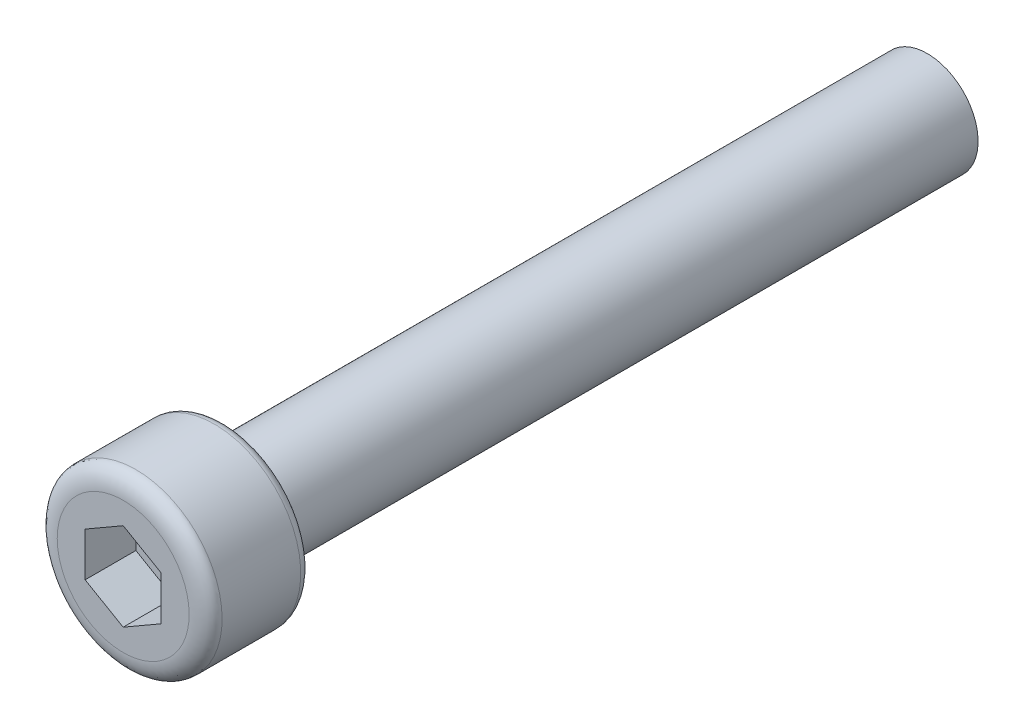
ISO-10303-21;
HEADER;
FILE_DESCRIPTION(('STEP AP214'),'2;1');
FILE_NAME('part.step','',(''),(''),'','','');
FILE_SCHEMA(('AUTOMOTIVE_DESIGN { 1 0 10303 214 1 1 1 1 }'));
ENDSEC;
DATA;
#1=APPLICATION_CONTEXT('core data for automotive mechanical design processes');
#2=APPLICATION_PROTOCOL_DEFINITION('international standard','automotive_design',2000,#1);
#3=PRODUCT_CONTEXT('',#1,'mechanical');
#4=PRODUCT('Part','Part','',(#3));
#5=PRODUCT_RELATED_PRODUCT_CATEGORY('part','',(#4));
#6=PRODUCT_DEFINITION_FORMATION('','',#4);
#7=PRODUCT_DEFINITION_CONTEXT('part definition',#1,'design');
#8=PRODUCT_DEFINITION('design','',#6,#7);
#9=PRODUCT_DEFINITION_SHAPE('','',#8);
#10=(LENGTH_UNIT() NAMED_UNIT(*) SI_UNIT(.MILLI.,.METRE.));
#11=(NAMED_UNIT(*) PLANE_ANGLE_UNIT() SI_UNIT($,.RADIAN.));
#12=(NAMED_UNIT(*) SI_UNIT($,.STERADIAN.) SOLID_ANGLE_UNIT());
#13=UNCERTAINTY_MEASURE_WITH_UNIT(LENGTH_MEASURE(1.E-05),#10,'distance_accuracy_value','');
#14=(GEOMETRIC_REPRESENTATION_CONTEXT(3) GLOBAL_UNCERTAINTY_ASSIGNED_CONTEXT((#13)) GLOBAL_UNIT_ASSIGNED_CONTEXT((#10,
#11,#12)) REPRESENTATION_CONTEXT('',''));
#15=CARTESIAN_POINT('',(0.,0.,0.));
#16=DIRECTION('',(0.,0.,1.));
#17=DIRECTION('',(1.,0.,0.));
#18=AXIS2_PLACEMENT_3D('',#15,#16,#17);
#19=CARTESIAN_POINT('',(0.,0.,16.));
#20=DIRECTION('',(0.,0.,1.));
#21=DIRECTION('',(1.,0.,0.));
#22=AXIS2_PLACEMENT_3D('',#19,#20,#21);
#23=PLANE('',#22);
#24=DIRECTION('',(-0.866025403784439,0.5,0.));
#25=VECTOR('',#24,1.);
#26=CARTESIAN_POINT('',(1.5,0.86602540378444,16.));
#27=LINE('',#26,#25);
#28=CARTESIAN_POINT('',(1.5,0.86602540378444,16.));
#29=VERTEX_POINT('',#28);
#30=CARTESIAN_POINT('',(0.,1.73205080756888,16.));
#31=VERTEX_POINT('',#30);
#32=EDGE_CURVE('E61',#29,#31,#27,.T.);
#33=ORIENTED_EDGE('',*,*,#32,.F.);
#34=DIRECTION('',(0.,1.,0.));
#35=VECTOR('',#34,1.);
#36=CARTESIAN_POINT('',(1.5,-0.866025403784439,16.));
#37=LINE('',#36,#35);
#38=CARTESIAN_POINT('',(1.5,-0.866025403784439,16.));
#39=VERTEX_POINT('',#38);
#40=EDGE_CURVE('E144',#39,#29,#37,.T.);
#41=ORIENTED_EDGE('',*,*,#40,.F.);
#42=DIRECTION('',(0.866025403784439,0.5,0.));
#43=VECTOR('',#42,1.);
#44=CARTESIAN_POINT('',(0.,-1.73205080756888,16.));
#45=LINE('',#44,#43);
#46=CARTESIAN_POINT('',(0.,-1.73205080756888,16.));
#47=VERTEX_POINT('',#46);
#48=EDGE_CURVE('E142',#47,#39,#45,.T.);
#49=ORIENTED_EDGE('',*,*,#48,.F.);
#50=DIRECTION('',(0.866025403784438,-0.5,0.));
#51=VECTOR('',#50,1.);
#52=CARTESIAN_POINT('',(-1.5,-0.866025403784438,16.));
#53=LINE('',#52,#51);
#54=CARTESIAN_POINT('',(-1.5,-0.866025403784438,16.));
#55=VERTEX_POINT('',#54);
#56=EDGE_CURVE('E109',#55,#47,#53,.T.);
#57=ORIENTED_EDGE('',*,*,#56,.F.);
#58=DIRECTION('',(0.,-1.,0.));
#59=VECTOR('',#58,1.);
#60=CARTESIAN_POINT('',(-1.5,0.866025403784439,16.));
#61=LINE('',#60,#59);
#62=CARTESIAN_POINT('',(-1.5,0.866025403784439,16.));
#63=VERTEX_POINT('',#62);
#64=EDGE_CURVE('E138',#63,#55,#61,.T.);
#65=ORIENTED_EDGE('',*,*,#64,.F.);
#66=DIRECTION('',(-0.866025403784439,-0.5,0.));
#67=VECTOR('',#66,1.);
#68=CARTESIAN_POINT('',(0.,1.73205080756888,16.));
#69=LINE('',#68,#67);
#70=EDGE_CURVE('E135',#31,#63,#69,.T.);
#71=ORIENTED_EDGE('',*,*,#70,.F.);
#72=EDGE_LOOP('',(#33,#41,#49,#57,#65,#71));
#73=FACE_BOUND('',#72,.T.);
#74=CARTESIAN_POINT('',(-2.6,0.,16.));
#75=CARTESIAN_POINT('',(-2.6,0.340339195747885,16.));
#76=CARTESIAN_POINT('',(-2.53232895612653,0.68054450708638,16.));
#77=CARTESIAN_POINT('',(-2.27184461293216,1.30940934121209,16.));
#78=CARTESIAN_POINT('',(-2.07913378430198,1.5978214778681,16.));
#79=CARTESIAN_POINT('',(-1.59782147786807,2.07913378430194,16.));
#80=CARTESIAN_POINT('',(-1.30940934121209,2.27184461293216,16.));
#81=CARTESIAN_POINT('',(-0.680544507086378,2.53232895612653,16.));
#82=CARTESIAN_POINT('',(-0.340339195747888,2.6,16.));
#83=CARTESIAN_POINT('',(0.340339195747889,2.6,16.));
#84=CARTESIAN_POINT('',(0.680544507086413,2.53232895612653,16.));
#85=CARTESIAN_POINT('',(1.30940934121205,2.27184461293216,16.));
#86=CARTESIAN_POINT('',(1.59782147786806,2.07913378430191,16.));
#87=CARTESIAN_POINT('',(2.07913378430199,1.59782147786813,16.));
#88=CARTESIAN_POINT('',(2.27184461293214,1.30940934121206,16.));
#89=CARTESIAN_POINT('',(2.53232895612655,0.680544507086402,16.));
#90=CARTESIAN_POINT('',(2.6,0.340339195748111,16.));
#91=CARTESIAN_POINT('',(2.6,-0.340339195748118,16.));
#92=CARTESIAN_POINT('',(2.53232895612663,-0.680544507086151,16.));
#93=CARTESIAN_POINT('',(2.27184461293207,-1.30940934121232,16.));
#94=CARTESIAN_POINT('',(2.07913378430184,-1.59782147786829,16.));
#95=CARTESIAN_POINT('',(1.59782147786821,-2.07913378430177,16.));
#96=CARTESIAN_POINT('',(1.30940934121224,-2.27184461293209,16.));
#97=CARTESIAN_POINT('',(0.68054450708623,-2.53232895612661,16.));
#98=CARTESIAN_POINT('',(0.340339195748087,-2.60000000000001,16.));
#99=CARTESIAN_POINT('',(-0.340339195748083,-2.60000000000001,16.));
#100=CARTESIAN_POINT('',(-0.680544507086233,-2.53232895612661,16.));
#101=CARTESIAN_POINT('',(-1.30940934121224,-2.27184461293209,16.));
#102=CARTESIAN_POINT('',(-1.59782147786814,-2.07913378430198,16.));
#103=CARTESIAN_POINT('',(-2.0791337843019,-1.59782147786808,16.));
#104=CARTESIAN_POINT('',(-2.27184461293223,-1.30940934121205,16.));
#105=CARTESIAN_POINT('',(-2.53232895612646,-0.680544507086417,16.));
#106=CARTESIAN_POINT('',(-2.6,-0.340339195747892,16.));
#107=CARTESIAN_POINT('',(-2.6,0.,16.));
#108=(BOUNDED_CURVE() B_SPLINE_CURVE(3,(#74,#75,#76,#77,#78,#79,#80,#81,#82,#83,#84,#85,#86,#87,
#88,#89,#90,#91,#92,#93,#94,#95,#96,#97,#98,#99,#100,#101,#102,#103,#104,#105,#106,#107),
.UNSPECIFIED.,.T.,.F.) B_SPLINE_CURVE_WITH_KNOTS((4,2,2,2,2,2,2,2,2,2,2,2,2,2,2,2,4),
(-3.14159265358979,-2.74889357189107,-2.35619449019234,-1.96349540849362,-1.5707963267949,
-1.17809724509617,-0.785398163397448,-0.392699081698724,0.,0.392699081698724,0.785398163397448,
1.17809724509617,1.5707963267949,1.96349540849362,2.35619449019234,2.74889357189107,
3.14159265358979),
.UNSPECIFIED.) CURVE() GEOMETRIC_REPRESENTATION_ITEM() RATIONAL_B_SPLINE_CURVE((1.,1.,1.,1.,1.,
1.,1.,1.,1.,1.,1.,1.,1.,1.,1.,1.,1.,1.,1.,1.,1.,1.,1.,1.,1.,1.,1.,1.,1.,1.,1.,1.,1.,1.)) REPRESENTATION_ITEM(''));
#109=CARTESIAN_POINT('',(-2.6,0.,16.));
#110=VERTEX_POINT('',#109);
#111=EDGE_CURVE('E12',#110,#110,#108,.F.);
#112=ORIENTED_EDGE('',*,*,#111,.T.);
#113=EDGE_LOOP('',(#112));
#114=FACE_BOUND('',#113,.T.);
#115=ADVANCED_FACE('F40',(#73,#114),#23,.T.);
#116=CARTESIAN_POINT('',(0.,0.,-16.));
#117=DIRECTION('',(0.,0.,-1.));
#118=DIRECTION('',(-1.,0.,0.));
#119=AXIS2_PLACEMENT_3D('',#116,#117,#118);
#120=CYLINDRICAL_SURFACE('',#119,3.4);
#121=CARTESIAN_POINT('',(-3.4,0.,15.5));
#122=CARTESIAN_POINT('',(-3.4,-0.445058948285704,15.5));
#123=CARTESIAN_POINT('',(-3.31150709647314,-0.889942816959172,15.5));
#124=CARTESIAN_POINT('',(-2.97087372460362,-1.71230452312344,15.5));
#125=CARTESIAN_POINT('',(-2.71886725639478,-2.08945885567375,15.5));
#126=CARTESIAN_POINT('',(-2.08945885567374,-2.71886725639479,15.5));
#127=CARTESIAN_POINT('',(-1.71230452312376,-2.97087372460349,15.5));
#128=CARTESIAN_POINT('',(-0.889942816958865,-3.31150709647327,15.5));
#129=CARTESIAN_POINT('',(-0.445058948285955,-3.40000000000001,15.5));
#130=CARTESIAN_POINT('',(0.44505894828596,-3.40000000000001,15.5));
#131=CARTESIAN_POINT('',(0.889942816958893,-3.31150709647326,15.5));
#132=CARTESIAN_POINT('',(1.71230452312372,-2.97087372460351,15.5));
#133=CARTESIAN_POINT('',(2.08945885567385,-2.71886725639468,15.5));
#134=CARTESIAN_POINT('',(2.71886725639468,-2.08945885567385,15.5));
#135=CARTESIAN_POINT('',(2.97087372460348,-1.71230452312378,15.5));
#136=CARTESIAN_POINT('',(3.31150709647328,-0.889942816958835,15.5));
#137=CARTESIAN_POINT('',(3.4,-0.445058948285999,15.5));
#138=CARTESIAN_POINT('',(3.4,0.445058948285992,15.5));
#139=CARTESIAN_POINT('',(3.31150709647316,0.889942816959107,15.5));
#140=CARTESIAN_POINT('',(2.97087372460359,1.7123045231235,15.5));
#141=CARTESIAN_POINT('',(2.71886725639486,2.08945885567366,15.5));
#142=CARTESIAN_POINT('',(2.08945885567366,2.71886725639486,15.5));
#143=CARTESIAN_POINT('',(1.7123045231235,2.97087372460359,15.5));
#144=CARTESIAN_POINT('',(0.889942816959111,3.31150709647316,15.5));
#145=CARTESIAN_POINT('',(0.445058948285701,3.4,15.5));
#146=CARTESIAN_POINT('',(-0.4450589482857,3.4,15.5));
#147=CARTESIAN_POINT('',(-0.889942816959134,3.31150709647315,15.5));
#148=CARTESIAN_POINT('',(-1.71230452312348,2.9708737246036,15.5));
#149=CARTESIAN_POINT('',(-2.08945885567363,2.71886725639489,15.5));
#150=CARTESIAN_POINT('',(-2.7188672563949,2.08945885567362,15.5));
#151=CARTESIAN_POINT('',(-2.97087372460359,1.7123045231235,15.5));
#152=CARTESIAN_POINT('',(-3.31150709647316,0.889942816959117,15.5));
#153=CARTESIAN_POINT('',(-3.4,0.445058948285697,15.5));
#154=CARTESIAN_POINT('',(-3.4,0.,15.5));
#155=(BOUNDED_CURVE() B_SPLINE_CURVE(3,(#121,#122,#123,#124,#125,#126,#127,#128,#129,#130,#131,
#132,#133,#134,#135,#136,#137,#138,#139,#140,#141,#142,#143,#144,#145,#146,#147,#148,#149,#150,
#151,#152,#153,#154),.UNSPECIFIED.,.T.,.F.) B_SPLINE_CURVE_WITH_KNOTS((4,2,2,2,2,2,2,2,2,2,2,2,
2,2,2,2,4),(-3.14159265358979,-2.74889357189107,-2.35619449019234,-1.96349540849362,
-1.5707963267949,-1.17809724509617,-0.785398163397448,-0.392699081698724,0.,0.392699081698724,
0.785398163397448,1.17809724509617,1.5707963267949,1.96349540849362,2.35619449019234,
2.74889357189107,3.14159265358979),
.UNSPECIFIED.) CURVE() GEOMETRIC_REPRESENTATION_ITEM() RATIONAL_B_SPLINE_CURVE((1.,1.,1.,1.,1.,
1.,1.,1.,1.,1.,1.,1.,1.,1.,1.,1.,1.,1.,1.,1.,1.,1.,1.,1.,1.,1.,1.,1.,1.,1.,1.,1.,1.,1.)) REPRESENTATION_ITEM(''));
#156=CARTESIAN_POINT('',(-3.4,0.,15.5));
#157=VERTEX_POINT('',#156);
#158=EDGE_CURVE('E54',#157,#157,#155,.F.);
#159=ORIENTED_EDGE('',*,*,#158,.T.);
#160=EDGE_LOOP('',(#159));
#161=FACE_BOUND('',#160,.T.);
#162=CARTESIAN_POINT('',(0.,0.,12.4));
#163=DIRECTION('',(0.,0.,-1.));
#164=DIRECTION('',(-1.,0.,0.));
#165=AXIS2_PLACEMENT_3D('',#162,#163,#164);
#166=CIRCLE('',#165,3.4);
#167=CARTESIAN_POINT('',(-3.4,0.,12.4));
#168=VERTEX_POINT('',#167);
#169=EDGE_CURVE('E165',#168,#168,#166,.F.);
#170=ORIENTED_EDGE('',*,*,#169,.T.);
#171=EDGE_LOOP('',(#170));
#172=FACE_BOUND('',#171,.T.);
#173=ADVANCED_FACE('F177',(#161,#172),#120,.T.);
#174=CARTESIAN_POINT('',(0.,3.4,12.));
#175=DIRECTION('',(0.,0.,-1.));
#176=DIRECTION('',(-1.,0.,0.));
#177=AXIS2_PLACEMENT_3D('',#174,#175,#176);
#178=PLANE('',#177);
#179=CARTESIAN_POINT('',(0.,0.,12.));
#180=DIRECTION('',(0.,0.,-1.));
#181=DIRECTION('',(-1.,0.,0.));
#182=AXIS2_PLACEMENT_3D('',#179,#180,#181);
#183=CIRCLE('',#182,3.);
#184=CARTESIAN_POINT('',(-3.,0.,12.));
#185=VERTEX_POINT('',#184);
#186=EDGE_CURVE('E162',#185,#185,#183,.T.);
#187=ORIENTED_EDGE('',*,*,#186,.T.);
#188=EDGE_LOOP('',(#187));
#189=FACE_BOUND('',#188,.T.);
#190=CARTESIAN_POINT('',(0.,0.,12.));
#191=DIRECTION('',(0.,0.,-1.));
#192=DIRECTION('',(-1.,0.,0.));
#193=AXIS2_PLACEMENT_3D('',#190,#191,#192);
#194=CIRCLE('',#193,2.00000000000001);
#195=CARTESIAN_POINT('',(-2.00000000000001,0.,12.));
#196=VERTEX_POINT('',#195);
#197=EDGE_CURVE('E148',#196,#196,#194,.T.);
#198=ORIENTED_EDGE('',*,*,#197,.F.);
#199=EDGE_LOOP('',(#198));
#200=FACE_BOUND('',#199,.T.);
#201=ADVANCED_FACE('F187',(#189,#200),#178,.T.);
#202=CARTESIAN_POINT('',(0.,0.,-16.));
#203=DIRECTION('',(0.,0.,-1.));
#204=DIRECTION('',(-1.,0.,0.));
#205=AXIS2_PLACEMENT_3D('',#202,#203,#204);
#206=CYLINDRICAL_SURFACE('',#205,2.00000000000001);
#207=CARTESIAN_POINT('',(0.,0.,-15.7));
#208=DIRECTION('',(0.,0.,-1.));
#209=DIRECTION('',(-1.,0.,0.));
#210=AXIS2_PLACEMENT_3D('',#207,#208,#209);
#211=CIRCLE('',#210,2.00000000000001);
#212=CARTESIAN_POINT('',(-2.00000000000001,0.,-15.7));
#213=VERTEX_POINT('',#212);
#214=EDGE_CURVE('E159',#213,#213,#211,.F.);
#215=ORIENTED_EDGE('',*,*,#214,.T.);
#216=EDGE_LOOP('',(#215));
#217=FACE_BOUND('',#216,.T.);
#218=ORIENTED_EDGE('',*,*,#197,.T.);
#219=EDGE_LOOP('',(#218));
#220=FACE_BOUND('',#219,.T.);
#221=ADVANCED_FACE('F236',(#217,#220),#206,.T.);
#222=CARTESIAN_POINT('',(0.,2.,-16.));
#223=DIRECTION('',(0.,0.,-1.));
#224=DIRECTION('',(-1.,0.,0.));
#225=AXIS2_PLACEMENT_3D('',#222,#223,#224);
#226=PLANE('',#225);
#227=CARTESIAN_POINT('',(0.,0.,-16.));
#228=DIRECTION('',(0.,0.,-1.));
#229=DIRECTION('',(-1.,0.,0.));
#230=AXIS2_PLACEMENT_3D('',#227,#228,#229);
#231=CIRCLE('',#230,1.48038475772934);
#232=CARTESIAN_POINT('',(-1.48038475772934,0.,-16.));
#233=VERTEX_POINT('',#232);
#234=EDGE_CURVE('E156',#233,#233,#231,.T.);
#235=ORIENTED_EDGE('',*,*,#234,.T.);
#236=EDGE_LOOP('',(#235));
#237=FACE_BOUND('',#236,.T.);
#238=ADVANCED_FACE('F228',(#237),#226,.T.);
#239=CARTESIAN_POINT('',(0.,0.,-16.));
#240=DIRECTION('',(0.,0.,1.));
#241=DIRECTION('',(1.,0.,0.));
#242=AXIS2_PLACEMENT_3D('',#239,#240,#241);
#243=CONICAL_SURFACE('',#242,1.48038475772934,1.0471975511966);
#244=ORIENTED_EDGE('',*,*,#214,.F.);
#245=EDGE_LOOP('',(#244));
#246=FACE_BOUND('',#245,.T.);
#247=ORIENTED_EDGE('',*,*,#234,.F.);
#248=EDGE_LOOP('',(#247));
#249=FACE_BOUND('',#248,.T.);
#250=ADVANCED_FACE('F194',(#246,#249),#243,.T.);
#251=CARTESIAN_POINT('',(0.,0.,12.4));
#252=DIRECTION('',(0.,0.,-1.));
#253=DIRECTION('',(-1.,0.,0.));
#254=AXIS2_PLACEMENT_3D('',#251,#252,#253);
#255=TOROIDAL_SURFACE('',#254,3.,0.4);
#256=ORIENTED_EDGE('',*,*,#169,.F.);
#257=EDGE_LOOP('',(#256));
#258=FACE_BOUND('',#257,.T.);
#259=ORIENTED_EDGE('',*,*,#186,.F.);
#260=EDGE_LOOP('',(#259));
#261=FACE_BOUND('',#260,.T.);
#262=ADVANCED_FACE('F217',(#258,#261),#255,.T.);
#263=CARTESIAN_POINT('',(-2.6,0.,16.));
#264=CARTESIAN_POINT('',(-2.6,-0.340339195747892,16.));
#265=CARTESIAN_POINT('',(-2.53232895612646,-0.680544507086417,16.));
#266=CARTESIAN_POINT('',(-2.27184461293223,-1.30940934121205,16.));
#267=CARTESIAN_POINT('',(-2.0791337843019,-1.59782147786808,16.));
#268=CARTESIAN_POINT('',(-1.59782147786814,-2.07913378430198,16.));
#269=CARTESIAN_POINT('',(-1.30940934121224,-2.27184461293209,16.));
#270=CARTESIAN_POINT('',(-0.680544507086233,-2.53232895612661,16.));
#271=CARTESIAN_POINT('',(-0.340339195748083,-2.60000000000001,16.));
#272=CARTESIAN_POINT('',(0.340339195748087,-2.60000000000001,16.));
#273=CARTESIAN_POINT('',(0.68054450708623,-2.53232895612661,16.));
#274=CARTESIAN_POINT('',(1.30940934121224,-2.27184461293209,16.));
#275=CARTESIAN_POINT('',(1.59782147786821,-2.07913378430177,16.));
#276=CARTESIAN_POINT('',(2.07913378430184,-1.59782147786829,16.));
#277=CARTESIAN_POINT('',(2.27184461293207,-1.30940934121232,16.));
#278=CARTESIAN_POINT('',(2.53232895612663,-0.680544507086151,16.));
#279=CARTESIAN_POINT('',(2.6,-0.340339195748118,16.));
#280=CARTESIAN_POINT('',(2.6,0.340339195748111,16.));
#281=CARTESIAN_POINT('',(2.53232895612655,0.680544507086402,16.));
#282=CARTESIAN_POINT('',(2.27184461293214,1.30940934121206,16.));
#283=CARTESIAN_POINT('',(2.07913378430199,1.59782147786813,16.));
#284=CARTESIAN_POINT('',(1.59782147786806,2.07913378430191,16.));
#285=CARTESIAN_POINT('',(1.30940934121205,2.27184461293216,16.));
#286=CARTESIAN_POINT('',(0.680544507086413,2.53232895612653,16.));
#287=CARTESIAN_POINT('',(0.340339195747889,2.6,16.));
#288=CARTESIAN_POINT('',(-0.340339195747888,2.6,16.));
#289=CARTESIAN_POINT('',(-0.680544507086378,2.53232895612653,16.));
#290=CARTESIAN_POINT('',(-1.30940934121209,2.27184461293216,16.));
#291=CARTESIAN_POINT('',(-1.59782147786807,2.07913378430194,16.));
#292=CARTESIAN_POINT('',(-2.07913378430198,1.5978214778681,16.));
#293=CARTESIAN_POINT('',(-2.27184461293216,1.30940934121209,16.));
#294=CARTESIAN_POINT('',(-2.53232895612653,0.68054450708638,16.));
#295=CARTESIAN_POINT('',(-2.6,0.340339195747885,16.));
#296=CARTESIAN_POINT('',(-2.6,0.,16.));
#297=CARTESIAN_POINT('',(-3.4,0.,16.));
#298=CARTESIAN_POINT('',(-3.4,-0.445058948285704,16.));
#299=CARTESIAN_POINT('',(-3.31150709647311,-0.889942816959163,16.));
#300=CARTESIAN_POINT('',(-2.97087372460364,-1.71230452312345,16.));
#301=CARTESIAN_POINT('',(-2.71886725639471,-2.08945885567367,16.));
#302=CARTESIAN_POINT('',(-2.08945885567381,-2.71886725639486,16.));
#303=CARTESIAN_POINT('',(-1.71230452312377,-2.97087372460352,16.));
#304=CARTESIAN_POINT('',(-0.889942816958852,-3.31150709647324,16.));
#305=CARTESIAN_POINT('',(-0.445058948285955,-3.40000000000001,16.));
#306=CARTESIAN_POINT('',(0.44505894828596,-3.40000000000001,16.));
#307=CARTESIAN_POINT('',(0.889942816958885,-3.31150709647324,16.));
#308=CARTESIAN_POINT('',(1.71230452312373,-2.97087372460352,16.));
#309=CARTESIAN_POINT('',(2.08945885567385,-2.71886725639468,16.));
#310=CARTESIAN_POINT('',(2.71886725639468,-2.08945885567385,16.));
#311=CARTESIAN_POINT('',(2.9708737246035,-1.71230452312379,16.));
#312=CARTESIAN_POINT('',(3.31150709647326,-0.889942816958828,16.));
#313=CARTESIAN_POINT('',(3.4,-0.445058948285999,16.));
#314=CARTESIAN_POINT('',(3.4,0.445058948285992,16.));
#315=CARTESIAN_POINT('',(3.31150709647318,0.889942816959117,16.));
#316=CARTESIAN_POINT('',(2.97087372460357,1.71230452312349,16.));
#317=CARTESIAN_POINT('',(2.7188672563949,2.0894588556737,16.));
#318=CARTESIAN_POINT('',(2.08945885567363,2.71886725639482,16.));
#319=CARTESIAN_POINT('',(1.71230452312347,2.97087372460352,16.));
#320=CARTESIAN_POINT('',(0.889942816959141,3.31150709647323,16.));
#321=CARTESIAN_POINT('',(0.445058948285701,3.4,16.));
#322=CARTESIAN_POINT('',(-0.4450589482857,3.4,16.));
#323=CARTESIAN_POINT('',(-0.889942816959107,3.31150709647308,16.));
#324=CARTESIAN_POINT('',(-1.71230452312351,2.97087372460366,16.));
#325=CARTESIAN_POINT('',(-2.0894588556736,2.71886725639485,16.));
#326=CARTESIAN_POINT('',(-2.71886725639493,2.08945885567366,16.));
#327=CARTESIAN_POINT('',(-2.97087372460357,1.71230452312349,16.));
#328=CARTESIAN_POINT('',(-3.31150709647318,0.889942816959128,16.));
#329=CARTESIAN_POINT('',(-3.4,0.445058948285697,16.));
#330=CARTESIAN_POINT('',(-3.4,0.,16.));
#331=CARTESIAN_POINT('',(-3.4,0.,15.5));
#332=CARTESIAN_POINT('',(-3.4,-0.445058948285704,15.5));
#333=CARTESIAN_POINT('',(-3.31150709647314,-0.889942816959172,15.5));
#334=CARTESIAN_POINT('',(-2.97087372460362,-1.71230452312344,15.5));
#335=CARTESIAN_POINT('',(-2.71886725639478,-2.08945885567375,15.5));
#336=CARTESIAN_POINT('',(-2.08945885567374,-2.71886725639479,15.5));
#337=CARTESIAN_POINT('',(-1.71230452312376,-2.97087372460349,15.5));
#338=CARTESIAN_POINT('',(-0.889942816958865,-3.31150709647327,15.5));
#339=CARTESIAN_POINT('',(-0.445058948285955,-3.40000000000001,15.5));
#340=CARTESIAN_POINT('',(0.44505894828596,-3.40000000000001,15.5));
#341=CARTESIAN_POINT('',(0.889942816958893,-3.31150709647326,15.5));
#342=CARTESIAN_POINT('',(1.71230452312372,-2.97087372460351,15.5));
#343=CARTESIAN_POINT('',(2.08945885567385,-2.71886725639468,15.5));
#344=CARTESIAN_POINT('',(2.71886725639468,-2.08945885567385,15.5));
#345=CARTESIAN_POINT('',(2.97087372460348,-1.71230452312378,15.5));
#346=CARTESIAN_POINT('',(3.31150709647328,-0.889942816958835,15.5));
#347=CARTESIAN_POINT('',(3.4,-0.445058948285999,15.5));
#348=CARTESIAN_POINT('',(3.4,0.445058948285992,15.5));
#349=CARTESIAN_POINT('',(3.31150709647316,0.889942816959107,15.5));
#350=CARTESIAN_POINT('',(2.97087372460359,1.7123045231235,15.5));
#351=CARTESIAN_POINT('',(2.71886725639486,2.08945885567366,15.5));
#352=CARTESIAN_POINT('',(2.08945885567366,2.71886725639486,15.5));
#353=CARTESIAN_POINT('',(1.7123045231235,2.97087372460359,15.5));
#354=CARTESIAN_POINT('',(0.889942816959111,3.31150709647316,15.5));
#355=CARTESIAN_POINT('',(0.445058948285701,3.4,15.5));
#356=CARTESIAN_POINT('',(-0.4450589482857,3.4,15.5));
#357=CARTESIAN_POINT('',(-0.889942816959134,3.31150709647315,15.5));
#358=CARTESIAN_POINT('',(-1.71230452312348,2.9708737246036,15.5));
#359=CARTESIAN_POINT('',(-2.08945885567363,2.71886725639489,15.5));
#360=CARTESIAN_POINT('',(-2.7188672563949,2.08945885567362,15.5));
#361=CARTESIAN_POINT('',(-2.97087372460359,1.7123045231235,15.5));
#362=CARTESIAN_POINT('',(-3.31150709647316,0.889942816959117,15.5));
#363=CARTESIAN_POINT('',(-3.4,0.445058948285697,15.5));
#364=CARTESIAN_POINT('',(-3.4,0.,15.5));
#365=(BOUNDED_SURFACE() B_SPLINE_SURFACE(2,3,((#263,#264,#265,#266,#267,#268,#269,#270,#271,
#272,#273,#274,#275,#276,#277,#278,#279,#280,#281,#282,#283,#284,#285,#286,#287,#288,#289,#290,
#291,#292,#293,#294,#295,#296),(#297,#298,#299,#300,#301,#302,#303,#304,#305,#306,#307,#308,
#309,#310,#311,#312,#313,#314,#315,#316,#317,#318,#319,#320,#321,#322,#323,#324,#325,#326,#327,
#328,#329,#330),(#331,#332,#333,#334,#335,#336,#337,#338,#339,#340,#341,#342,#343,#344,#345,
#346,#347,#348,#349,#350,#351,#352,#353,#354,#355,#356,#357,#358,#359,#360,#361,#362,#363,
#364)),.UNSPECIFIED.,.F.,.T.,.F.) B_SPLINE_SURFACE_WITH_KNOTS((3,3),(4,2,2,2,2,2,2,2,2,2,2,2,2,
2,2,2,4),(0.,1.),(-3.14159265358979,-2.74889357189107,-2.35619449019234,-1.96349540849362,
-1.5707963267949,-1.17809724509617,-0.785398163397448,-0.392699081698724,0.,0.392699081698724,
0.785398163397448,1.17809724509617,1.5707963267949,1.96349540849362,2.35619449019234,
2.74889357189107,3.14159265358979),
.UNSPECIFIED.) GEOMETRIC_REPRESENTATION_ITEM() RATIONAL_B_SPLINE_SURFACE(((1.,1.,1.,1.,1.,1.,1.,
1.,1.,1.,1.,1.,1.,1.,1.,1.,1.,1.,1.,1.,1.,1.,1.,1.,1.,1.,1.,1.,1.,1.,1.,1.,1.,1.),
(0.707106781186548,0.707106781186548,0.707106781186548,0.707106781186548,0.707106781186547,
0.707106781186547,0.707106781186548,0.707106781186548,0.707106781186548,0.707106781186548,
0.707106781186548,0.707106781186548,0.707106781186548,0.707106781186548,0.707106781186548,
0.707106781186548,0.707106781186548,0.707106781186548,0.707106781186548,0.707106781186548,
0.707106781186548,0.707106781186548,0.707106781186548,0.707106781186548,0.707106781186548,
0.707106781186548,0.707106781186548,0.707106781186548,0.707106781186547,0.707106781186547,
0.707106781186548,0.707106781186548,0.707106781186548,0.707106781186548),(1.,1.,1.,1.,1.,1.,1.,
1.,1.,1.,1.,1.,1.,1.,1.,1.,1.,1.,1.,1.,1.,1.,1.,1.,1.,1.,1.,1.,1.,1.,1.,1.,1.,1.))) REPRESENTATION_ITEM('') SURFACE());
#366=ORIENTED_EDGE('',*,*,#111,.F.);
#367=EDGE_LOOP('',(#366));
#368=FACE_BOUND('',#367,.T.);
#369=ORIENTED_EDGE('',*,*,#158,.F.);
#370=EDGE_LOOP('',(#369));
#371=FACE_BOUND('',#370,.T.);
#372=ADVANCED_FACE('F43',(#368,#371),#365,.T.);
#373=CARTESIAN_POINT('',(1.5,0.86602540378444,14.));
#374=DIRECTION('',(0.5,0.866025403784439,0.));
#375=DIRECTION('',(-0.866025403784439,0.5,0.));
#376=AXIS2_PLACEMENT_3D('',#373,#374,#375);
#377=PLANE('',#376);
#378=ORIENTED_EDGE('',*,*,#32,.T.);
#379=DIRECTION('',(0.,0.,1.));
#380=VECTOR('',#379,1.);
#381=CARTESIAN_POINT('',(0.,1.73205080756888,14.));
#382=LINE('',#381,#380);
#383=CARTESIAN_POINT('',(0.,1.73205080756888,14.));
#384=VERTEX_POINT('',#383);
#385=EDGE_CURVE('E91',#384,#31,#382,.T.);
#386=ORIENTED_EDGE('',*,*,#385,.F.);
#387=DIRECTION('',(-0.866025403784439,0.5,0.));
#388=VECTOR('',#387,1.);
#389=CARTESIAN_POINT('',(1.5,0.86602540378444,14.));
#390=LINE('',#389,#388);
#391=CARTESIAN_POINT('',(1.5,0.86602540378444,14.));
#392=VERTEX_POINT('',#391);
#393=EDGE_CURVE('E146',#392,#384,#390,.T.);
#394=ORIENTED_EDGE('',*,*,#393,.F.);
#395=DIRECTION('',(0.,0.,1.));
#396=VECTOR('',#395,1.);
#397=CARTESIAN_POINT('',(1.5,0.86602540378444,14.));
#398=LINE('',#397,#396);
#399=EDGE_CURVE('E69',#392,#29,#398,.T.);
#400=ORIENTED_EDGE('',*,*,#399,.T.);
#401=EDGE_LOOP('',(#378,#386,#394,#400));
#402=FACE_BOUND('',#401,.T.);
#403=ADVANCED_FACE('F216',(#402),#377,.F.);
#404=CARTESIAN_POINT('',(1.5,-0.866025403784439,14.));
#405=DIRECTION('',(1.,0.,0.));
#406=DIRECTION('',(0.,0.,-1.));
#407=AXIS2_PLACEMENT_3D('',#404,#405,#406);
#408=PLANE('',#407);
#409=ORIENTED_EDGE('',*,*,#40,.T.);
#410=ORIENTED_EDGE('',*,*,#399,.F.);
#411=DIRECTION('',(0.,1.,0.));
#412=VECTOR('',#411,1.);
#413=CARTESIAN_POINT('',(1.5,-0.866025403784439,14.));
#414=LINE('',#413,#412);
#415=CARTESIAN_POINT('',(1.5,-0.866025403784439,14.));
#416=VERTEX_POINT('',#415);
#417=EDGE_CURVE('E121',#416,#392,#414,.T.);
#418=ORIENTED_EDGE('',*,*,#417,.F.);
#419=DIRECTION('',(0.,0.,1.));
#420=VECTOR('',#419,1.);
#421=CARTESIAN_POINT('',(1.5,-0.866025403784439,14.));
#422=LINE('',#421,#420);
#423=EDGE_CURVE('E113',#416,#39,#422,.T.);
#424=ORIENTED_EDGE('',*,*,#423,.T.);
#425=EDGE_LOOP('',(#409,#410,#418,#424));
#426=FACE_BOUND('',#425,.T.);
#427=ADVANCED_FACE('F222',(#426),#408,.F.);
#428=CARTESIAN_POINT('',(0.,-1.73205080756888,14.));
#429=DIRECTION('',(0.5,-0.866025403784439,0.));
#430=DIRECTION('',(0.866025403784439,0.5,0.));
#431=AXIS2_PLACEMENT_3D('',#428,#429,#430);
#432=PLANE('',#431);
#433=ORIENTED_EDGE('',*,*,#48,.T.);
#434=ORIENTED_EDGE('',*,*,#423,.F.);
#435=DIRECTION('',(0.866025403784439,0.5,0.));
#436=VECTOR('',#435,1.);
#437=CARTESIAN_POINT('',(0.,-1.73205080756888,14.));
#438=LINE('',#437,#436);
#439=CARTESIAN_POINT('',(0.,-1.73205080756888,14.));
#440=VERTEX_POINT('',#439);
#441=EDGE_CURVE('E117',#440,#416,#438,.T.);
#442=ORIENTED_EDGE('',*,*,#441,.F.);
#443=DIRECTION('',(0.,0.,1.));
#444=VECTOR('',#443,1.);
#445=CARTESIAN_POINT('',(0.,-1.73205080756888,14.));
#446=LINE('',#445,#444);
#447=EDGE_CURVE('E102',#440,#47,#446,.T.);
#448=ORIENTED_EDGE('',*,*,#447,.T.);
#449=EDGE_LOOP('',(#433,#434,#442,#448));
#450=FACE_BOUND('',#449,.T.);
#451=ADVANCED_FACE('F118',(#450),#432,.F.);
#452=CARTESIAN_POINT('',(-1.5,-0.866025403784438,14.));
#453=DIRECTION('',(-0.5,-0.866025403784439,0.));
#454=DIRECTION('',(0.866025403784439,-0.5,0.));
#455=AXIS2_PLACEMENT_3D('',#452,#453,#454);
#456=PLANE('',#455);
#457=ORIENTED_EDGE('',*,*,#56,.T.);
#458=ORIENTED_EDGE('',*,*,#447,.F.);
#459=DIRECTION('',(0.866025403784438,-0.5,0.));
#460=VECTOR('',#459,1.);
#461=CARTESIAN_POINT('',(-1.5,-0.866025403784438,14.));
#462=LINE('',#461,#460);
#463=CARTESIAN_POINT('',(-1.5,-0.866025403784438,14.));
#464=VERTEX_POINT('',#463);
#465=EDGE_CURVE('E106',#464,#440,#462,.T.);
#466=ORIENTED_EDGE('',*,*,#465,.F.);
#467=DIRECTION('',(0.,0.,1.));
#468=VECTOR('',#467,1.);
#469=CARTESIAN_POINT('',(-1.5,-0.866025403784438,14.));
#470=LINE('',#469,#468);
#471=EDGE_CURVE('E114',#464,#55,#470,.T.);
#472=ORIENTED_EDGE('',*,*,#471,.T.);
#473=EDGE_LOOP('',(#457,#458,#466,#472));
#474=FACE_BOUND('',#473,.T.);
#475=ADVANCED_FACE('F104',(#474),#456,.F.);
#476=CARTESIAN_POINT('',(-1.5,0.866025403784439,14.));
#477=DIRECTION('',(-1.,0.,0.));
#478=DIRECTION('',(0.,0.,1.));
#479=AXIS2_PLACEMENT_3D('',#476,#477,#478);
#480=PLANE('',#479);
#481=ORIENTED_EDGE('',*,*,#64,.T.);
#482=ORIENTED_EDGE('',*,*,#471,.F.);
#483=DIRECTION('',(0.,-1.,0.));
#484=VECTOR('',#483,1.);
#485=CARTESIAN_POINT('',(-1.5,0.866025403784439,14.));
#486=LINE('',#485,#484);
#487=CARTESIAN_POINT('',(-1.5,0.866025403784439,14.));
#488=VERTEX_POINT('',#487);
#489=EDGE_CURVE('E127',#488,#464,#486,.T.);
#490=ORIENTED_EDGE('',*,*,#489,.F.);
#491=DIRECTION('',(0.,0.,1.));
#492=VECTOR('',#491,1.);
#493=CARTESIAN_POINT('',(-1.5,0.866025403784439,14.));
#494=LINE('',#493,#492);
#495=EDGE_CURVE('E151',#488,#63,#494,.T.);
#496=ORIENTED_EDGE('',*,*,#495,.T.);
#497=EDGE_LOOP('',(#481,#482,#490,#496));
#498=FACE_BOUND('',#497,.T.);
#499=ADVANCED_FACE('F250',(#498),#480,.F.);
#500=CARTESIAN_POINT('',(0.,1.73205080756888,14.));
#501=DIRECTION('',(-0.5,0.866025403784439,0.));
#502=DIRECTION('',(-0.866025403784439,-0.5,0.));
#503=AXIS2_PLACEMENT_3D('',#500,#501,#502);
#504=PLANE('',#503);
#505=ORIENTED_EDGE('',*,*,#70,.T.);
#506=ORIENTED_EDGE('',*,*,#495,.F.);
#507=DIRECTION('',(-0.866025403784439,-0.5,0.));
#508=VECTOR('',#507,1.);
#509=CARTESIAN_POINT('',(0.,1.73205080756888,14.));
#510=LINE('',#509,#508);
#511=EDGE_CURVE('E129',#384,#488,#510,.T.);
#512=ORIENTED_EDGE('',*,*,#511,.F.);
#513=ORIENTED_EDGE('',*,*,#385,.T.);
#514=EDGE_LOOP('',(#505,#506,#512,#513));
#515=FACE_BOUND('',#514,.T.);
#516=ADVANCED_FACE('F247',(#515),#504,.F.);
#517=CARTESIAN_POINT('',(0.,0.,14.));
#518=DIRECTION('',(0.,0.,1.));
#519=DIRECTION('',(1.,0.,0.));
#520=AXIS2_PLACEMENT_3D('',#517,#518,#519);
#521=PLANE('',#520);
#522=ORIENTED_EDGE('',*,*,#393,.T.);
#523=ORIENTED_EDGE('',*,*,#511,.T.);
#524=ORIENTED_EDGE('',*,*,#489,.T.);
#525=ORIENTED_EDGE('',*,*,#465,.T.);
#526=ORIENTED_EDGE('',*,*,#441,.T.);
#527=ORIENTED_EDGE('',*,*,#417,.T.);
#528=EDGE_LOOP('',(#522,#523,#524,#525,#526,#527));
#529=FACE_BOUND('',#528,.T.);
#530=ADVANCED_FACE('F124',(#529),#521,.T.);
#531=CLOSED_SHELL('',(#115,#173,#201,#221,#238,#250,#262,#372,#403,#427,#451,#475,#499,#516,#530));
#532=MANIFOLD_SOLID_BREP('B2',#531);
#533=ADVANCED_BREP_SHAPE_REPRESENTATION('',(#18,#532),#14);
#534=SHAPE_DEFINITION_REPRESENTATION(#9,#533);
ENDSEC;
END-ISO-10303-21;
